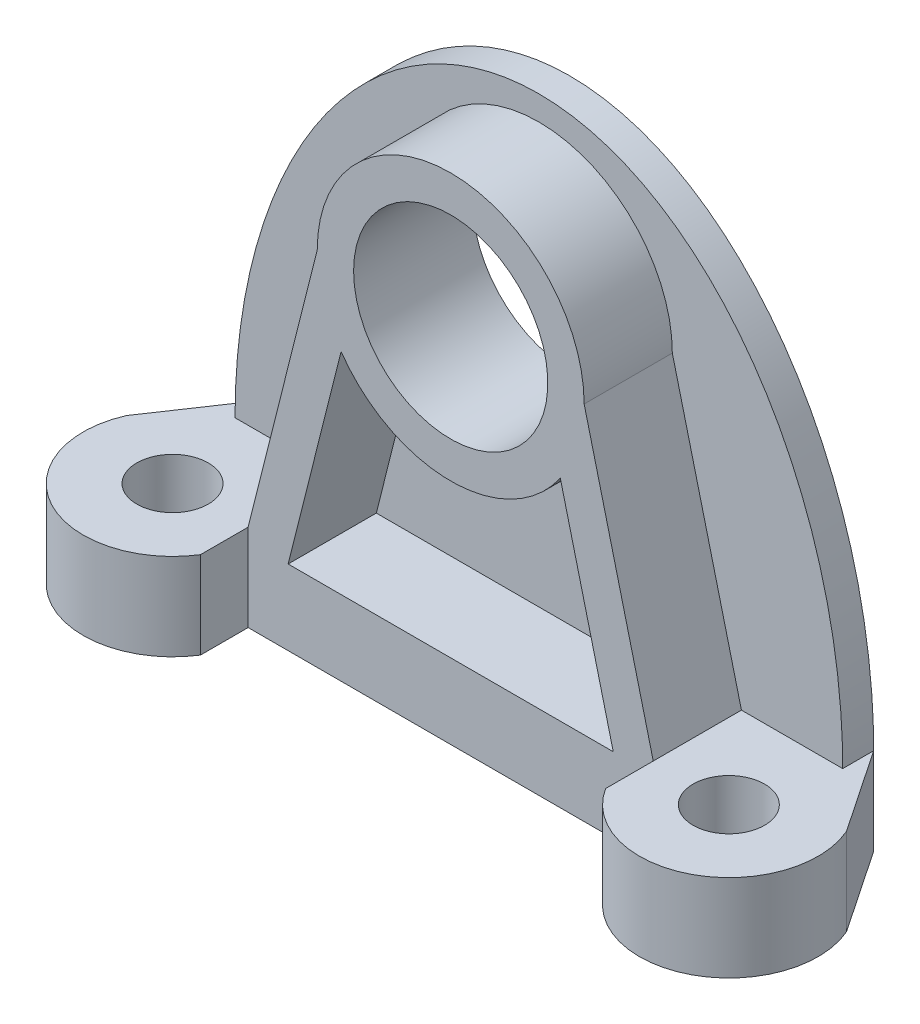
ISO-10303-21;
HEADER;
FILE_DESCRIPTION(('STEP AP214'),'2;1');
FILE_NAME('part.step','',(''),(''),'','','');
FILE_SCHEMA(('AUTOMOTIVE_DESIGN { 1 0 10303 214 1 1 1 1 }'));
ENDSEC;
DATA;
#1=APPLICATION_CONTEXT('core data for automotive mechanical design processes');
#2=APPLICATION_PROTOCOL_DEFINITION('international standard','automotive_design',2000,#1);
#3=PRODUCT_CONTEXT('',#1,'mechanical');
#4=PRODUCT('Part','Part','',(#3));
#5=PRODUCT_RELATED_PRODUCT_CATEGORY('part','',(#4));
#6=PRODUCT_DEFINITION_FORMATION('','',#4);
#7=PRODUCT_DEFINITION_CONTEXT('part definition',#1,'design');
#8=PRODUCT_DEFINITION('design','',#6,#7);
#9=PRODUCT_DEFINITION_SHAPE('','',#8);
#10=(LENGTH_UNIT() NAMED_UNIT(*) SI_UNIT(.MILLI.,.METRE.));
#11=(NAMED_UNIT(*) PLANE_ANGLE_UNIT() SI_UNIT($,.RADIAN.));
#12=(NAMED_UNIT(*) SI_UNIT($,.STERADIAN.) SOLID_ANGLE_UNIT());
#13=UNCERTAINTY_MEASURE_WITH_UNIT(LENGTH_MEASURE(1.E-05),#10,'distance_accuracy_value','');
#14=(GEOMETRIC_REPRESENTATION_CONTEXT(3) GLOBAL_UNCERTAINTY_ASSIGNED_CONTEXT((#13)) GLOBAL_UNIT_ASSIGNED_CONTEXT((#10,
#11,#12)) REPRESENTATION_CONTEXT('',''));
#15=CARTESIAN_POINT('',(0.,0.,0.));
#16=DIRECTION('',(0.,0.,1.));
#17=DIRECTION('',(1.,0.,0.));
#18=AXIS2_PLACEMENT_3D('',#15,#16,#17);
#19=CARTESIAN_POINT('',(-17.,7.3,14.));
#20=DIRECTION('',(-1.,0.,0.));
#21=DIRECTION('',(0.,0.,1.));
#22=AXIS2_PLACEMENT_3D('',#19,#20,#21);
#23=PLANE('',#22);
#24=DIRECTION('',(0.,-1.,0.));
#25=VECTOR('',#24,1.);
#26=CARTESIAN_POINT('',(-17.,7.3,10.));
#27=LINE('',#26,#25);
#28=CARTESIAN_POINT('',(-17.,7.3,10.));
#29=VERTEX_POINT('',#28);
#30=CARTESIAN_POINT('',(-17.,0.,10.));
#31=VERTEX_POINT('',#30);
#32=EDGE_CURVE('E168',#29,#31,#27,.T.);
#33=ORIENTED_EDGE('',*,*,#32,.F.);
#34=DIRECTION('',(0.,0.,-1.));
#35=VECTOR('',#34,1.);
#36=CARTESIAN_POINT('',(-17.,7.3,14.));
#37=LINE('',#36,#35);
#38=CARTESIAN_POINT('',(-17.,7.3,14.));
#39=VERTEX_POINT('',#38);
#40=EDGE_CURVE('E185',#39,#29,#37,.T.);
#41=ORIENTED_EDGE('',*,*,#40,.F.);
#42=DIRECTION('',(0.,-1.,0.));
#43=VECTOR('',#42,1.);
#44=CARTESIAN_POINT('',(-17.,7.3,14.));
#45=LINE('',#44,#43);
#46=CARTESIAN_POINT('',(-17.,0.,14.));
#47=VERTEX_POINT('',#46);
#48=EDGE_CURVE('E217',#39,#47,#45,.T.);
#49=ORIENTED_EDGE('',*,*,#48,.T.);
#50=DIRECTION('',(0.,0.,-1.));
#51=VECTOR('',#50,1.);
#52=CARTESIAN_POINT('',(-17.,0.,14.));
#53=LINE('',#52,#51);
#54=EDGE_CURVE('E206',#47,#31,#53,.T.);
#55=ORIENTED_EDGE('',*,*,#54,.T.);
#56=EDGE_LOOP('',(#33,#41,#49,#55));
#57=FACE_BOUND('',#56,.T.);
#58=ADVANCED_FACE('F33',(#57),#23,.F.);
#59=CARTESIAN_POINT('',(17.,7.3,14.));
#60=DIRECTION('',(1.,0.,0.));
#61=DIRECTION('',(0.,0.,-1.));
#62=AXIS2_PLACEMENT_3D('',#59,#60,#61);
#63=PLANE('',#62);
#64=DIRECTION('',(0.,0.,1.));
#65=VECTOR('',#64,1.);
#66=CARTESIAN_POINT('',(17.,7.3,14.));
#67=LINE('',#66,#65);
#68=CARTESIAN_POINT('',(17.,7.3,10.));
#69=VERTEX_POINT('',#68);
#70=CARTESIAN_POINT('',(17.,7.3,14.));
#71=VERTEX_POINT('',#70);
#72=EDGE_CURVE('E183',#69,#71,#67,.T.);
#73=ORIENTED_EDGE('',*,*,#72,.F.);
#74=DIRECTION('',(0.,-1.,0.));
#75=VECTOR('',#74,1.);
#76=CARTESIAN_POINT('',(17.,7.3,10.));
#77=LINE('',#76,#75);
#78=CARTESIAN_POINT('',(17.,0.,10.));
#79=VERTEX_POINT('',#78);
#80=EDGE_CURVE('E157',#69,#79,#77,.T.);
#81=ORIENTED_EDGE('',*,*,#80,.T.);
#82=DIRECTION('',(0.,0.,1.));
#83=VECTOR('',#82,1.);
#84=CARTESIAN_POINT('',(17.,0.,14.));
#85=LINE('',#84,#83);
#86=CARTESIAN_POINT('',(17.,0.,14.));
#87=VERTEX_POINT('',#86);
#88=EDGE_CURVE('E210',#79,#87,#85,.T.);
#89=ORIENTED_EDGE('',*,*,#88,.T.);
#90=DIRECTION('',(0.,-1.,0.));
#91=VECTOR('',#90,1.);
#92=CARTESIAN_POINT('',(17.,7.3,14.));
#93=LINE('',#92,#91);
#94=EDGE_CURVE('E169',#71,#87,#93,.T.);
#95=ORIENTED_EDGE('',*,*,#94,.F.);
#96=EDGE_LOOP('',(#73,#81,#89,#95));
#97=FACE_BOUND('',#96,.T.);
#98=ADVANCED_FACE('F184',(#97),#63,.F.);
#99=CARTESIAN_POINT('',(-17.,6.3,2.6));
#100=DIRECTION('',(0.,-1.,0.));
#101=DIRECTION('',(0.,0.,-1.));
#102=AXIS2_PLACEMENT_3D('',#99,#100,#101);
#103=PLANE('',#102);
#104=DIRECTION('',(0.,0.,-1.));
#105=VECTOR('',#104,1.);
#106=CARTESIAN_POINT('',(-13.642524215412,6.3,58.9751212351741));
#107=LINE('',#106,#105);
#108=CARTESIAN_POINT('',(-13.642524215412,6.3,10.));
#109=VERTEX_POINT('',#108);
#110=CARTESIAN_POINT('',(-13.642524215412,6.3,2.6));
#111=VERTEX_POINT('',#110);
#112=EDGE_CURVE('E354',#109,#111,#107,.T.);
#113=ORIENTED_EDGE('',*,*,#112,.F.);
#114=DIRECTION('',(1.,0.,0.));
#115=VECTOR('',#114,1.);
#116=CARTESIAN_POINT('',(-17.,6.3,10.));
#117=LINE('',#116,#115);
#118=CARTESIAN_POINT('',(13.642524215412,6.3,10.));
#119=VERTEX_POINT('',#118);
#120=EDGE_CURVE('E260',#109,#119,#117,.T.);
#121=ORIENTED_EDGE('',*,*,#120,.T.);
#122=DIRECTION('',(0.,0.,-1.));
#123=VECTOR('',#122,1.);
#124=CARTESIAN_POINT('',(13.642524215412,6.3,58.9751212351741));
#125=LINE('',#124,#123);
#126=CARTESIAN_POINT('',(13.642524215412,6.3,2.6));
#127=VERTEX_POINT('',#126);
#128=EDGE_CURVE('E180',#119,#127,#125,.T.);
#129=ORIENTED_EDGE('',*,*,#128,.T.);
#130=DIRECTION('',(1.,0.,0.));
#131=VECTOR('',#130,1.);
#132=CARTESIAN_POINT('',(-17.,6.3,2.6));
#133=LINE('',#132,#131);
#134=EDGE_CURVE('E257',#111,#127,#133,.T.);
#135=ORIENTED_EDGE('',*,*,#134,.F.);
#136=EDGE_LOOP('',(#113,#121,#129,#135));
#137=FACE_BOUND('',#136,.T.);
#138=ADVANCED_FACE('F286',(#137),#103,.F.);
#139=CARTESIAN_POINT('',(0.,0.,2.6));
#140=DIRECTION('',(0.,0.,1.));
#141=DIRECTION('',(1.,0.,0.));
#142=AXIS2_PLACEMENT_3D('',#139,#140,#141);
#143=PLANE('',#142);
#144=CARTESIAN_POINT('',(0.,30.35,2.6));
#145=DIRECTION('',(0.,0.,1.));
#146=DIRECTION('',(1.,0.,0.));
#147=AXIS2_PLACEMENT_3D('',#144,#145,#146);
#148=CIRCLE('',#147,11.2);
#149=CARTESIAN_POINT('',(11.2,30.35,2.6));
#150=VERTEX_POINT('',#149);
#151=CARTESIAN_POINT('',(-11.2,30.35,2.6));
#152=VERTEX_POINT('',#151);
#153=EDGE_CURVE('E360',#150,#152,#148,.T.);
#154=ORIENTED_EDGE('',*,*,#153,.F.);
#155=DIRECTION('',(-0.244020251184388,0.969770136172438,0.));
#156=VECTOR('',#155,1.);
#157=CARTESIAN_POINT('',(17.,7.3,2.6));
#158=LINE('',#157,#156);
#159=CARTESIAN_POINT('',(17.,7.3,2.6));
#160=VERTEX_POINT('',#159);
#161=EDGE_CURVE('E179',#160,#150,#158,.T.);
#162=ORIENTED_EDGE('',*,*,#161,.F.);
#163=DIRECTION('',(-1.,0.,0.));
#164=VECTOR('',#163,1.);
#165=CARTESIAN_POINT('',(25.5,7.3,2.59999999999999));
#166=LINE('',#165,#164);
#167=CARTESIAN_POINT('',(25.5,7.3,2.59999999999999));
#168=VERTEX_POINT('',#167);
#169=EDGE_CURVE('E190',#168,#160,#166,.T.);
#170=ORIENTED_EDGE('',*,*,#169,.F.);
#171=CARTESIAN_POINT('',(0.,7.3,2.59999999999999));
#172=DIRECTION('',(0.,0.,-1.));
#173=DIRECTION('',(0.,-1.,0.));
#174=AXIS2_PLACEMENT_3D('',#171,#172,#173);
#175=ELLIPSE('',#174,36.3,25.5);
#176=CARTESIAN_POINT('',(-25.5,7.3,2.59999999999999));
#177=VERTEX_POINT('',#176);
#178=EDGE_CURVE('E334',#177,#168,#175,.T.);
#179=ORIENTED_EDGE('',*,*,#178,.F.);
#180=CARTESIAN_POINT('',(-17.,7.3,2.6));
#181=VERTEX_POINT('',#180);
#182=EDGE_CURVE('E333',#181,#177,#166,.T.);
#183=ORIENTED_EDGE('',*,*,#182,.F.);
#184=DIRECTION('',(-0.244020251184388,-0.969770136172438,0.));
#185=VECTOR('',#184,1.);
#186=CARTESIAN_POINT('',(-17.,7.3,2.6));
#187=LINE('',#186,#185);
#188=EDGE_CURVE('E369',#152,#181,#187,.T.);
#189=ORIENTED_EDGE('',*,*,#188,.F.);
#190=EDGE_LOOP('',(#154,#162,#170,#179,#183,#189));
#191=FACE_BOUND('',#190,.T.);
#192=ADVANCED_FACE('F282',(#191),#143,.T.);
#193=CARTESIAN_POINT('',(0.,30.35,2.6));
#194=DIRECTION('',(0.,0.,1.));
#195=DIRECTION('',(1.,0.,0.));
#196=AXIS2_PLACEMENT_3D('',#193,#194,#195);
#197=CIRCLE('',#196,11.2);
#198=CARTESIAN_POINT('',(-9.19865015464646,23.9605684656284,2.6));
#199=VERTEX_POINT('',#198);
#200=CARTESIAN_POINT('',(9.19865015464646,23.9605684656284,2.6));
#201=VERTEX_POINT('',#200);
#202=EDGE_CURVE('E48',#199,#201,#197,.T.);
#203=ORIENTED_EDGE('',*,*,#202,.F.);
#204=DIRECTION('',(0.244020251184388,0.969770136172438,0.));
#205=VECTOR('',#204,1.);
#206=CARTESIAN_POINT('',(-13.642524215412,6.3,2.6));
#207=LINE('',#206,#205);
#208=EDGE_CURVE('E351',#111,#199,#207,.T.);
#209=ORIENTED_EDGE('',*,*,#208,.F.);
#210=ORIENTED_EDGE('',*,*,#134,.T.);
#211=DIRECTION('',(0.244020251184388,-0.969770136172438,0.));
#212=VECTOR('',#211,1.);
#213=CARTESIAN_POINT('',(13.642524215412,6.3,2.6));
#214=LINE('',#213,#212);
#215=EDGE_CURVE('E339',#201,#127,#214,.T.);
#216=ORIENTED_EDGE('',*,*,#215,.F.);
#217=EDGE_LOOP('',(#203,#209,#210,#216));
#218=FACE_BOUND('',#217,.T.);
#219=ADVANCED_FACE('F285',(#218),#143,.T.);
#220=CARTESIAN_POINT('',(23.3442887702248,7.3,10.));
#221=DIRECTION('',(0.,-1.,0.));
#222=DIRECTION('',(0.,0.,-1.));
#223=AXIS2_PLACEMENT_3D('',#220,#221,#222);
#224=PLANE('',#223);
#225=CARTESIAN_POINT('',(23.3442887702248,7.3,10.));
#226=DIRECTION('',(0.,1.,0.));
#227=DIRECTION('',(0.,0.,1.));
#228=AXIS2_PLACEMENT_3D('',#225,#226,#227);
#229=CIRCLE('',#228,3.);
#230=CARTESIAN_POINT('',(23.3442887702248,7.3,13.));
#231=VERTEX_POINT('',#230);
#232=EDGE_CURVE('E200',#231,#231,#229,.T.);
#233=ORIENTED_EDGE('',*,*,#232,.F.);
#234=EDGE_LOOP('',(#233));
#235=FACE_BOUND('',#234,.T.);
#236=DIRECTION('',(-0.558915454806079,0.,-0.829224646509566));
#237=VECTOR('',#236,1.);
#238=CARTESIAN_POINT('',(25.5,7.3,0.));
#239=LINE('',#238,#237);
#240=CARTESIAN_POINT('',(30.2181523126585,7.3,7.));
#241=VERTEX_POINT('',#240);
#242=CARTESIAN_POINT('',(25.5,7.3,0.));
#243=VERTEX_POINT('',#242);
#244=EDGE_CURVE('E213',#241,#243,#239,.T.);
#245=ORIENTED_EDGE('',*,*,#244,.T.);
#246=DIRECTION('',(0.,0.,-1.));
#247=VECTOR('',#246,1.);
#248=CARTESIAN_POINT('',(25.5,7.3,65.1994408920719));
#249=LINE('',#248,#247);
#250=EDGE_CURVE('E268',#168,#243,#249,.T.);
#251=ORIENTED_EDGE('',*,*,#250,.F.);
#252=ORIENTED_EDGE('',*,*,#169,.T.);
#253=EDGE_CURVE('E175',#160,#69,#67,.T.);
#254=ORIENTED_EDGE('',*,*,#253,.T.);
#255=ORIENTED_EDGE('',*,*,#72,.T.);
#256=CARTESIAN_POINT('',(23.3442887702248,7.3,10.));
#257=DIRECTION('',(0.,1.,0.));
#258=DIRECTION('',(0.,0.,-1.));
#259=AXIS2_PLACEMENT_3D('',#256,#257,#258);
#260=CIRCLE('',#259,7.5);
#261=EDGE_CURVE('E57',#71,#241,#260,.T.);
#262=ORIENTED_EDGE('',*,*,#261,.T.);
#263=EDGE_LOOP('',(#245,#251,#252,#254,#255,#262));
#264=FACE_BOUND('',#263,.T.);
#265=ADVANCED_FACE('F188',(#235,#264),#224,.F.);
#266=ORIENTED_EDGE('',*,*,#182,.T.);
#267=DIRECTION('',(0.,0.,-1.));
#268=VECTOR('',#267,1.);
#269=CARTESIAN_POINT('',(-25.5,7.3,65.1994408920719));
#270=LINE('',#269,#268);
#271=CARTESIAN_POINT('',(-25.5,7.3,0.));
#272=VERTEX_POINT('',#271);
#273=EDGE_CURVE('E327',#177,#272,#270,.T.);
#274=ORIENTED_EDGE('',*,*,#273,.T.);
#275=DIRECTION('',(-0.558915454806079,0.,0.829224646509566));
#276=VECTOR('',#275,1.);
#277=CARTESIAN_POINT('',(-25.5,7.3,0.));
#278=LINE('',#277,#276);
#279=CARTESIAN_POINT('',(-30.2181523126585,7.3,7.));
#280=VERTEX_POINT('',#279);
#281=EDGE_CURVE('E98',#272,#280,#278,.T.);
#282=ORIENTED_EDGE('',*,*,#281,.T.);
#283=CARTESIAN_POINT('',(-23.3442887702248,7.3,10.));
#284=DIRECTION('',(0.,1.,0.));
#285=DIRECTION('',(0.,0.,1.));
#286=AXIS2_PLACEMENT_3D('',#283,#284,#285);
#287=CIRCLE('',#286,7.5);
#288=EDGE_CURVE('E244',#280,#39,#287,.T.);
#289=ORIENTED_EDGE('',*,*,#288,.T.);
#290=ORIENTED_EDGE('',*,*,#40,.T.);
#291=DIRECTION('',(0.,0.,-1.));
#292=VECTOR('',#291,1.);
#293=CARTESIAN_POINT('',(-17.,7.3,58.9751212351741));
#294=LINE('',#293,#292);
#295=EDGE_CURVE('E355',#29,#181,#294,.T.);
#296=ORIENTED_EDGE('',*,*,#295,.T.);
#297=EDGE_LOOP('',(#266,#274,#282,#289,#290,#296));
#298=FACE_BOUND('',#297,.T.);
#299=CARTESIAN_POINT('',(-23.3442887702248,7.3,10.));
#300=DIRECTION('',(0.,1.,0.));
#301=DIRECTION('',(0.,0.,-1.));
#302=AXIS2_PLACEMENT_3D('',#299,#300,#301);
#303=CIRCLE('',#302,3.);
#304=CARTESIAN_POINT('',(-23.3442887702248,7.3,7.));
#305=VERTEX_POINT('',#304);
#306=EDGE_CURVE('E251',#305,#305,#303,.T.);
#307=ORIENTED_EDGE('',*,*,#306,.F.);
#308=EDGE_LOOP('',(#307));
#309=FACE_BOUND('',#308,.T.);
#310=ADVANCED_FACE('F299',(#298,#309),#224,.F.);
#311=CARTESIAN_POINT('',(23.3442887702248,0.,10.));
#312=DIRECTION('',(0.,-1.,0.));
#313=DIRECTION('',(0.,0.,-1.));
#314=AXIS2_PLACEMENT_3D('',#311,#312,#313);
#315=PLANE('',#314);
#316=CARTESIAN_POINT('',(23.3442887702248,0.,10.));
#317=DIRECTION('',(0.,1.,0.));
#318=DIRECTION('',(0.,0.,1.));
#319=AXIS2_PLACEMENT_3D('',#316,#317,#318);
#320=CIRCLE('',#319,3.);
#321=CARTESIAN_POINT('',(23.3442887702248,0.,13.));
#322=VERTEX_POINT('',#321);
#323=EDGE_CURVE('E248',#322,#322,#320,.T.);
#324=ORIENTED_EDGE('',*,*,#323,.T.);
#325=EDGE_LOOP('',(#324));
#326=FACE_BOUND('',#325,.T.);
#327=DIRECTION('',(-0.558915454806079,0.,-0.829224646509566));
#328=VECTOR('',#327,1.);
#329=CARTESIAN_POINT('',(25.5,0.,0.));
#330=LINE('',#329,#328);
#331=CARTESIAN_POINT('',(30.2181523126585,0.,7.));
#332=VERTEX_POINT('',#331);
#333=CARTESIAN_POINT('',(25.5,0.,0.));
#334=VERTEX_POINT('',#333);
#335=EDGE_CURVE('E196',#332,#334,#330,.T.);
#336=ORIENTED_EDGE('',*,*,#335,.F.);
#337=CARTESIAN_POINT('',(23.3442887702248,0.,10.));
#338=DIRECTION('',(0.,1.,0.));
#339=DIRECTION('',(0.,0.,-1.));
#340=AXIS2_PLACEMENT_3D('',#337,#338,#339);
#341=CIRCLE('',#340,7.5);
#342=EDGE_CURVE('E90',#87,#332,#341,.T.);
#343=ORIENTED_EDGE('',*,*,#342,.F.);
#344=ORIENTED_EDGE('',*,*,#88,.F.);
#345=DIRECTION('',(1.,0.,0.));
#346=VECTOR('',#345,1.);
#347=CARTESIAN_POINT('',(17.,0.,10.));
#348=LINE('',#347,#346);
#349=EDGE_CURVE('E164',#31,#79,#348,.T.);
#350=ORIENTED_EDGE('',*,*,#349,.F.);
#351=ORIENTED_EDGE('',*,*,#54,.F.);
#352=CARTESIAN_POINT('',(-23.3442887702248,0.,10.));
#353=DIRECTION('',(0.,1.,0.));
#354=DIRECTION('',(0.,0.,1.));
#355=AXIS2_PLACEMENT_3D('',#352,#353,#354);
#356=CIRCLE('',#355,7.5);
#357=CARTESIAN_POINT('',(-30.2181523126585,0.,7.));
#358=VERTEX_POINT('',#357);
#359=EDGE_CURVE('E204',#358,#47,#356,.T.);
#360=ORIENTED_EDGE('',*,*,#359,.F.);
#361=DIRECTION('',(-0.558915454806079,0.,0.829224646509566));
#362=VECTOR('',#361,1.);
#363=CARTESIAN_POINT('',(-25.5,0.,0.));
#364=LINE('',#363,#362);
#365=CARTESIAN_POINT('',(-25.5,0.,0.));
#366=VERTEX_POINT('',#365);
#367=EDGE_CURVE('E202',#366,#358,#364,.T.);
#368=ORIENTED_EDGE('',*,*,#367,.F.);
#369=DIRECTION('',(-1.,0.,0.));
#370=VECTOR('',#369,1.);
#371=CARTESIAN_POINT('',(-25.5,0.,0.));
#372=LINE('',#371,#370);
#373=EDGE_CURVE('E199',#334,#366,#372,.T.);
#374=ORIENTED_EDGE('',*,*,#373,.F.);
#375=EDGE_LOOP('',(#336,#343,#344,#350,#351,#360,#368,#374));
#376=FACE_BOUND('',#375,.T.);
#377=CARTESIAN_POINT('',(-23.3442887702248,0.,10.));
#378=DIRECTION('',(0.,1.,0.));
#379=DIRECTION('',(0.,0.,-1.));
#380=AXIS2_PLACEMENT_3D('',#377,#378,#379);
#381=CIRCLE('',#380,3.);
#382=CARTESIAN_POINT('',(-23.3442887702248,0.,7.));
#383=VERTEX_POINT('',#382);
#384=EDGE_CURVE('E254',#383,#383,#381,.T.);
#385=ORIENTED_EDGE('',*,*,#384,.T.);
#386=EDGE_LOOP('',(#385));
#387=FACE_BOUND('',#386,.T.);
#388=ADVANCED_FACE('F232',(#326,#376,#387),#315,.T.);
#389=CARTESIAN_POINT('',(25.5,7.3,0.));
#390=DIRECTION('',(-0.829224646509566,0.,0.558915454806079));
#391=DIRECTION('',(0.558915454806079,0.,0.829224646509566));
#392=AXIS2_PLACEMENT_3D('',#389,#390,#391);
#393=PLANE('',#392);
#394=ORIENTED_EDGE('',*,*,#335,.T.);
#395=DIRECTION('',(0.,-1.,0.));
#396=VECTOR('',#395,1.);
#397=CARTESIAN_POINT('',(25.5,7.3,0.));
#398=LINE('',#397,#396);
#399=EDGE_CURVE('E11',#243,#334,#398,.T.);
#400=ORIENTED_EDGE('',*,*,#399,.F.);
#401=ORIENTED_EDGE('',*,*,#244,.F.);
#402=DIRECTION('',(0.,-1.,0.));
#403=VECTOR('',#402,1.);
#404=CARTESIAN_POINT('',(30.2181523126585,7.3,7.));
#405=LINE('',#404,#403);
#406=EDGE_CURVE('E191',#241,#332,#405,.T.);
#407=ORIENTED_EDGE('',*,*,#406,.T.);
#408=EDGE_LOOP('',(#394,#400,#401,#407));
#409=FACE_BOUND('',#408,.T.);
#410=ADVANCED_FACE('F35',(#409),#393,.F.);
#411=CARTESIAN_POINT('',(-25.5,7.3,0.));
#412=DIRECTION('',(0.,0.,1.));
#413=DIRECTION('',(1.,0.,0.));
#414=AXIS2_PLACEMENT_3D('',#411,#412,#413);
#415=PLANE('',#414);
#416=ORIENTED_EDGE('',*,*,#373,.T.);
#417=DIRECTION('',(0.,-1.,0.));
#418=VECTOR('',#417,1.);
#419=CARTESIAN_POINT('',(-25.5,7.3,0.));
#420=LINE('',#419,#418);
#421=EDGE_CURVE('E41',#272,#366,#420,.T.);
#422=ORIENTED_EDGE('',*,*,#421,.F.);
#423=CARTESIAN_POINT('',(0.,7.3,0.));
#424=DIRECTION('',(0.,0.,-1.));
#425=DIRECTION('',(0.,-1.,0.));
#426=AXIS2_PLACEMENT_3D('',#423,#424,#425);
#427=ELLIPSE('',#426,36.3,25.5);
#428=EDGE_CURVE('E263',#272,#243,#427,.T.);
#429=ORIENTED_EDGE('',*,*,#428,.T.);
#430=ORIENTED_EDGE('',*,*,#399,.T.);
#431=EDGE_LOOP('',(#416,#422,#429,#430));
#432=FACE_BOUND('',#431,.T.);
#433=CARTESIAN_POINT('',(0.,30.35,0.));
#434=DIRECTION('',(0.,0.,-1.));
#435=DIRECTION('',(-1.,0.,0.));
#436=AXIS2_PLACEMENT_3D('',#433,#434,#435);
#437=CIRCLE('',#436,8.15);
#438=CARTESIAN_POINT('',(-8.15,30.35,0.));
#439=VERTEX_POINT('',#438);
#440=EDGE_CURVE('E326',#439,#439,#437,.T.);
#441=ORIENTED_EDGE('',*,*,#440,.F.);
#442=EDGE_LOOP('',(#441));
#443=FACE_BOUND('',#442,.T.);
#444=ADVANCED_FACE('F317',(#432,#443),#415,.F.);
#445=CARTESIAN_POINT('',(-25.5,7.3,0.));
#446=DIRECTION('',(0.829224646509566,0.,0.558915454806079));
#447=DIRECTION('',(0.558915454806079,0.,-0.829224646509566));
#448=AXIS2_PLACEMENT_3D('',#445,#446,#447);
#449=PLANE('',#448);
#450=ORIENTED_EDGE('',*,*,#367,.T.);
#451=DIRECTION('',(0.,-1.,0.));
#452=VECTOR('',#451,1.);
#453=CARTESIAN_POINT('',(-30.2181523126585,7.3,7.));
#454=LINE('',#453,#452);
#455=EDGE_CURVE('E220',#280,#358,#454,.T.);
#456=ORIENTED_EDGE('',*,*,#455,.F.);
#457=ORIENTED_EDGE('',*,*,#281,.F.);
#458=ORIENTED_EDGE('',*,*,#421,.T.);
#459=EDGE_LOOP('',(#450,#456,#457,#458));
#460=FACE_BOUND('',#459,.T.);
#461=ADVANCED_FACE('F226',(#460),#449,.F.);
#462=CARTESIAN_POINT('',(-23.3442887702248,7.3,10.));
#463=DIRECTION('',(0.,-1.,0.));
#464=DIRECTION('',(0.,0.,-1.));
#465=AXIS2_PLACEMENT_3D('',#462,#463,#464);
#466=CYLINDRICAL_SURFACE('',#465,7.5);
#467=ORIENTED_EDGE('',*,*,#359,.T.);
#468=ORIENTED_EDGE('',*,*,#48,.F.);
#469=ORIENTED_EDGE('',*,*,#288,.F.);
#470=ORIENTED_EDGE('',*,*,#455,.T.);
#471=EDGE_LOOP('',(#467,#468,#469,#470));
#472=FACE_BOUND('',#471,.T.);
#473=ADVANCED_FACE('F237',(#472),#466,.T.);
#474=CARTESIAN_POINT('',(17.,7.3,10.));
#475=DIRECTION('',(0.,0.,-1.));
#476=DIRECTION('',(-1.,0.,0.));
#477=AXIS2_PLACEMENT_3D('',#474,#475,#476);
#478=PLANE('',#477);
#479=ORIENTED_EDGE('',*,*,#120,.F.);
#480=DIRECTION('',(-0.244020251184388,-0.969770136172438,0.));
#481=VECTOR('',#480,1.);
#482=CARTESIAN_POINT('',(-13.642524215412,6.3,10.));
#483=LINE('',#482,#481);
#484=CARTESIAN_POINT('',(-9.19865015464646,23.9605684656284,10.));
#485=VERTEX_POINT('',#484);
#486=EDGE_CURVE('E352',#485,#109,#483,.T.);
#487=ORIENTED_EDGE('',*,*,#486,.F.);
#488=CARTESIAN_POINT('',(0.,30.35,10.));
#489=DIRECTION('',(0.,0.,-1.));
#490=DIRECTION('',(-1.,0.,0.));
#491=AXIS2_PLACEMENT_3D('',#488,#489,#490);
#492=CIRCLE('',#491,11.2);
#493=CARTESIAN_POINT('',(9.19865015464646,23.9605684656284,10.));
#494=VERTEX_POINT('',#493);
#495=EDGE_CURVE('E347',#494,#485,#492,.T.);
#496=ORIENTED_EDGE('',*,*,#495,.F.);
#497=DIRECTION('',(-0.244020251184388,0.969770136172438,0.));
#498=VECTOR('',#497,1.);
#499=CARTESIAN_POINT('',(13.642524215412,6.3,10.));
#500=LINE('',#499,#498);
#501=EDGE_CURVE('E344',#119,#494,#500,.T.);
#502=ORIENTED_EDGE('',*,*,#501,.F.);
#503=EDGE_LOOP('',(#479,#487,#496,#502));
#504=FACE_BOUND('',#503,.T.);
#505=ORIENTED_EDGE('',*,*,#80,.F.);
#506=DIRECTION('',(0.244020251184388,-0.969770136172438,0.));
#507=VECTOR('',#506,1.);
#508=CARTESIAN_POINT('',(17.,7.3,10.));
#509=LINE('',#508,#507);
#510=CARTESIAN_POINT('',(11.2,30.35,10.));
#511=VERTEX_POINT('',#510);
#512=EDGE_CURVE('E161',#511,#69,#509,.T.);
#513=ORIENTED_EDGE('',*,*,#512,.F.);
#514=CARTESIAN_POINT('',(0.,30.35,10.));
#515=DIRECTION('',(0.,0.,-1.));
#516=DIRECTION('',(-1.,0.,0.));
#517=AXIS2_PLACEMENT_3D('',#514,#515,#516);
#518=CIRCLE('',#517,11.2);
#519=CARTESIAN_POINT('',(-11.2,30.35,10.));
#520=VERTEX_POINT('',#519);
#521=EDGE_CURVE('E361',#520,#511,#518,.T.);
#522=ORIENTED_EDGE('',*,*,#521,.F.);
#523=DIRECTION('',(0.244020251184388,0.969770136172438,0.));
#524=VECTOR('',#523,1.);
#525=CARTESIAN_POINT('',(-17.,7.3,10.));
#526=LINE('',#525,#524);
#527=EDGE_CURVE('E356',#29,#520,#526,.T.);
#528=ORIENTED_EDGE('',*,*,#527,.F.);
#529=ORIENTED_EDGE('',*,*,#32,.T.);
#530=ORIENTED_EDGE('',*,*,#349,.T.);
#531=EDGE_LOOP('',(#505,#513,#522,#528,#529,#530));
#532=FACE_BOUND('',#531,.T.);
#533=CARTESIAN_POINT('',(0.,30.35,10.));
#534=DIRECTION('',(0.,0.,-1.));
#535=DIRECTION('',(-1.,0.,0.));
#536=AXIS2_PLACEMENT_3D('',#533,#534,#535);
#537=CIRCLE('',#536,8.15);
#538=CARTESIAN_POINT('',(-8.15,30.35,10.));
#539=VERTEX_POINT('',#538);
#540=EDGE_CURVE('E336',#539,#539,#537,.T.);
#541=ORIENTED_EDGE('',*,*,#540,.T.);
#542=EDGE_LOOP('',(#541));
#543=FACE_BOUND('',#542,.T.);
#544=ADVANCED_FACE('F159',(#504,#532,#543),#478,.F.);
#545=CARTESIAN_POINT('',(23.3442887702248,7.3,10.));
#546=DIRECTION('',(0.,-1.,0.));
#547=DIRECTION('',(0.,0.,-1.));
#548=AXIS2_PLACEMENT_3D('',#545,#546,#547);
#549=CYLINDRICAL_SURFACE('',#548,7.5);
#550=ORIENTED_EDGE('',*,*,#342,.T.);
#551=ORIENTED_EDGE('',*,*,#406,.F.);
#552=ORIENTED_EDGE('',*,*,#261,.F.);
#553=ORIENTED_EDGE('',*,*,#94,.T.);
#554=EDGE_LOOP('',(#550,#551,#552,#553));
#555=FACE_BOUND('',#554,.T.);
#556=ADVANCED_FACE('F297',(#555),#549,.T.);
#557=CARTESIAN_POINT('',(23.3442887702248,7.3,10.));
#558=DIRECTION('',(0.,-1.,0.));
#559=DIRECTION('',(0.,0.,-1.));
#560=AXIS2_PLACEMENT_3D('',#557,#558,#559);
#561=CYLINDRICAL_SURFACE('',#560,3.);
#562=ORIENTED_EDGE('',*,*,#232,.T.);
#563=EDGE_LOOP('',(#562));
#564=FACE_BOUND('',#563,.T.);
#565=ORIENTED_EDGE('',*,*,#323,.F.);
#566=EDGE_LOOP('',(#565));
#567=FACE_BOUND('',#566,.T.);
#568=ADVANCED_FACE('F293',(#564,#567),#561,.F.);
#569=CARTESIAN_POINT('',(-23.3442887702248,7.3,10.));
#570=DIRECTION('',(0.,-1.,0.));
#571=DIRECTION('',(0.,0.,-1.));
#572=AXIS2_PLACEMENT_3D('',#569,#570,#571);
#573=CYLINDRICAL_SURFACE('',#572,3.);
#574=ORIENTED_EDGE('',*,*,#306,.T.);
#575=EDGE_LOOP('',(#574));
#576=FACE_BOUND('',#575,.T.);
#577=ORIENTED_EDGE('',*,*,#384,.F.);
#578=EDGE_LOOP('',(#577));
#579=FACE_BOUND('',#578,.T.);
#580=ADVANCED_FACE('F276',(#576,#579),#573,.F.);
#581=CARTESIAN_POINT('',(0.,7.3,65.1994408920719));
#582=DIRECTION('',(0.,0.,-1.));
#583=DIRECTION('',(0.,-1.,0.));
#584=AXIS2_PLACEMENT_3D('',#581,#582,#583);
#585=ELLIPSE('',#584,36.3,25.5);
#586=DIRECTION('',(0.,0.,-1.));
#587=VECTOR('',#586,1.);
#588=SURFACE_OF_LINEAR_EXTRUSION('',#585,#587);
#589=ORIENTED_EDGE('',*,*,#273,.F.);
#590=ORIENTED_EDGE('',*,*,#178,.T.);
#591=ORIENTED_EDGE('',*,*,#250,.T.);
#592=ORIENTED_EDGE('',*,*,#428,.F.);
#593=EDGE_LOOP('',(#589,#590,#591,#592));
#594=FACE_BOUND('',#593,.T.);
#595=ADVANCED_FACE('F271',(#594),#588,.T.);
#596=CARTESIAN_POINT('',(0.,30.35,65.1994408920719));
#597=DIRECTION('',(0.,0.,-1.));
#598=DIRECTION('',(-1.,0.,0.));
#599=AXIS2_PLACEMENT_3D('',#596,#597,#598);
#600=CYLINDRICAL_SURFACE('',#599,8.15);
#601=ORIENTED_EDGE('',*,*,#440,.T.);
#602=EDGE_LOOP('',(#601));
#603=FACE_BOUND('',#602,.T.);
#604=ORIENTED_EDGE('',*,*,#540,.F.);
#605=EDGE_LOOP('',(#604));
#606=FACE_BOUND('',#605,.T.);
#607=ADVANCED_FACE('F275',(#603,#606),#600,.F.);
#608=CARTESIAN_POINT('',(17.,7.3,58.9751212351741));
#609=DIRECTION('',(-0.969770136172438,-0.244020251184388,0.));
#610=DIRECTION('',(0.244020251184388,-0.969770136172438,0.));
#611=AXIS2_PLACEMENT_3D('',#608,#609,#610);
#612=PLANE('',#611);
#613=DIRECTION('',(0.,0.,-1.));
#614=VECTOR('',#613,1.);
#615=CARTESIAN_POINT('',(11.2,30.35,58.9751212351741));
#616=LINE('',#615,#614);
#617=EDGE_CURVE('E177',#511,#150,#616,.T.);
#618=ORIENTED_EDGE('',*,*,#617,.F.);
#619=ORIENTED_EDGE('',*,*,#512,.T.);
#620=ORIENTED_EDGE('',*,*,#253,.F.);
#621=ORIENTED_EDGE('',*,*,#161,.T.);
#622=EDGE_LOOP('',(#618,#619,#620,#621));
#623=FACE_BOUND('',#622,.T.);
#624=ADVANCED_FACE('F172',(#623),#612,.F.);
#625=CARTESIAN_POINT('',(0.,30.35,58.9751212351741));
#626=DIRECTION('',(0.,0.,-1.));
#627=DIRECTION('',(-1.,0.,0.));
#628=AXIS2_PLACEMENT_3D('',#625,#626,#627);
#629=CYLINDRICAL_SURFACE('',#628,11.2);
#630=DIRECTION('',(0.,0.,-1.));
#631=VECTOR('',#630,1.);
#632=CARTESIAN_POINT('',(-11.2,30.35,58.9751212351741));
#633=LINE('',#632,#631);
#634=EDGE_CURVE('E359',#520,#152,#633,.T.);
#635=ORIENTED_EDGE('',*,*,#634,.F.);
#636=ORIENTED_EDGE('',*,*,#521,.T.);
#637=ORIENTED_EDGE('',*,*,#617,.T.);
#638=ORIENTED_EDGE('',*,*,#153,.T.);
#639=EDGE_LOOP('',(#635,#636,#637,#638));
#640=FACE_BOUND('',#639,.T.);
#641=ADVANCED_FACE('F402',(#640),#629,.T.);
#642=CARTESIAN_POINT('',(-17.,7.3,58.9751212351741));
#643=DIRECTION('',(0.969770136172438,-0.244020251184388,0.));
#644=DIRECTION('',(0.244020251184388,0.969770136172438,0.));
#645=AXIS2_PLACEMENT_3D('',#642,#643,#644);
#646=PLANE('',#645);
#647=ORIENTED_EDGE('',*,*,#295,.F.);
#648=ORIENTED_EDGE('',*,*,#527,.T.);
#649=ORIENTED_EDGE('',*,*,#634,.T.);
#650=ORIENTED_EDGE('',*,*,#188,.T.);
#651=EDGE_LOOP('',(#647,#648,#649,#650));
#652=FACE_BOUND('',#651,.T.);
#653=ADVANCED_FACE('F398',(#652),#646,.F.);
#654=CARTESIAN_POINT('',(-13.642524215412,6.3,58.9751212351741));
#655=DIRECTION('',(-0.969770136172438,0.244020251184388,0.));
#656=DIRECTION('',(-0.244020251184388,-0.969770136172438,0.));
#657=AXIS2_PLACEMENT_3D('',#654,#655,#656);
#658=PLANE('',#657);
#659=DIRECTION('',(0.,0.,-1.));
#660=VECTOR('',#659,1.);
#661=CARTESIAN_POINT('',(-9.19865015464646,23.9605684656284,58.9751212351741));
#662=LINE('',#661,#660);
#663=EDGE_CURVE('E350',#485,#199,#662,.T.);
#664=ORIENTED_EDGE('',*,*,#663,.F.);
#665=ORIENTED_EDGE('',*,*,#486,.T.);
#666=ORIENTED_EDGE('',*,*,#112,.T.);
#667=ORIENTED_EDGE('',*,*,#208,.T.);
#668=EDGE_LOOP('',(#664,#665,#666,#667));
#669=FACE_BOUND('',#668,.T.);
#670=ADVANCED_FACE('F381',(#669),#658,.F.);
#671=CARTESIAN_POINT('',(0.,30.35,58.9751212351741));
#672=DIRECTION('',(0.,0.,-1.));
#673=DIRECTION('',(-1.,0.,0.));
#674=AXIS2_PLACEMENT_3D('',#671,#672,#673);
#675=CYLINDRICAL_SURFACE('',#674,11.2);
#676=DIRECTION('',(0.,0.,-1.));
#677=VECTOR('',#676,1.);
#678=CARTESIAN_POINT('',(9.19865015464646,23.9605684656284,58.9751212351741));
#679=LINE('',#678,#677);
#680=EDGE_CURVE('E341',#494,#201,#679,.T.);
#681=ORIENTED_EDGE('',*,*,#680,.F.);
#682=ORIENTED_EDGE('',*,*,#495,.T.);
#683=ORIENTED_EDGE('',*,*,#663,.T.);
#684=ORIENTED_EDGE('',*,*,#202,.T.);
#685=EDGE_LOOP('',(#681,#682,#683,#684));
#686=FACE_BOUND('',#685,.T.);
#687=ADVANCED_FACE('F390',(#686),#675,.T.);
#688=CARTESIAN_POINT('',(13.642524215412,6.3,58.9751212351741));
#689=DIRECTION('',(0.969770136172438,0.244020251184388,0.));
#690=DIRECTION('',(-0.244020251184388,0.969770136172438,0.));
#691=AXIS2_PLACEMENT_3D('',#688,#689,#690);
#692=PLANE('',#691);
#693=ORIENTED_EDGE('',*,*,#128,.F.);
#694=ORIENTED_EDGE('',*,*,#501,.T.);
#695=ORIENTED_EDGE('',*,*,#680,.T.);
#696=ORIENTED_EDGE('',*,*,#215,.T.);
#697=EDGE_LOOP('',(#693,#694,#695,#696));
#698=FACE_BOUND('',#697,.T.);
#699=ADVANCED_FACE('F388',(#698),#692,.F.);
#700=CLOSED_SHELL('',(#58,#98,#138,#192,#219,#265,#310,#388,#410,#444,#461,#473,#544,#556,#568,
#580,#595,#607,#624,#641,#653,#670,#687,#699));
#701=MANIFOLD_SOLID_BREP('B2',#700);
#702=ADVANCED_BREP_SHAPE_REPRESENTATION('',(#18,#701),#14);
#703=SHAPE_DEFINITION_REPRESENTATION(#9,#702);
ENDSEC;
END-ISO-10303-21;
